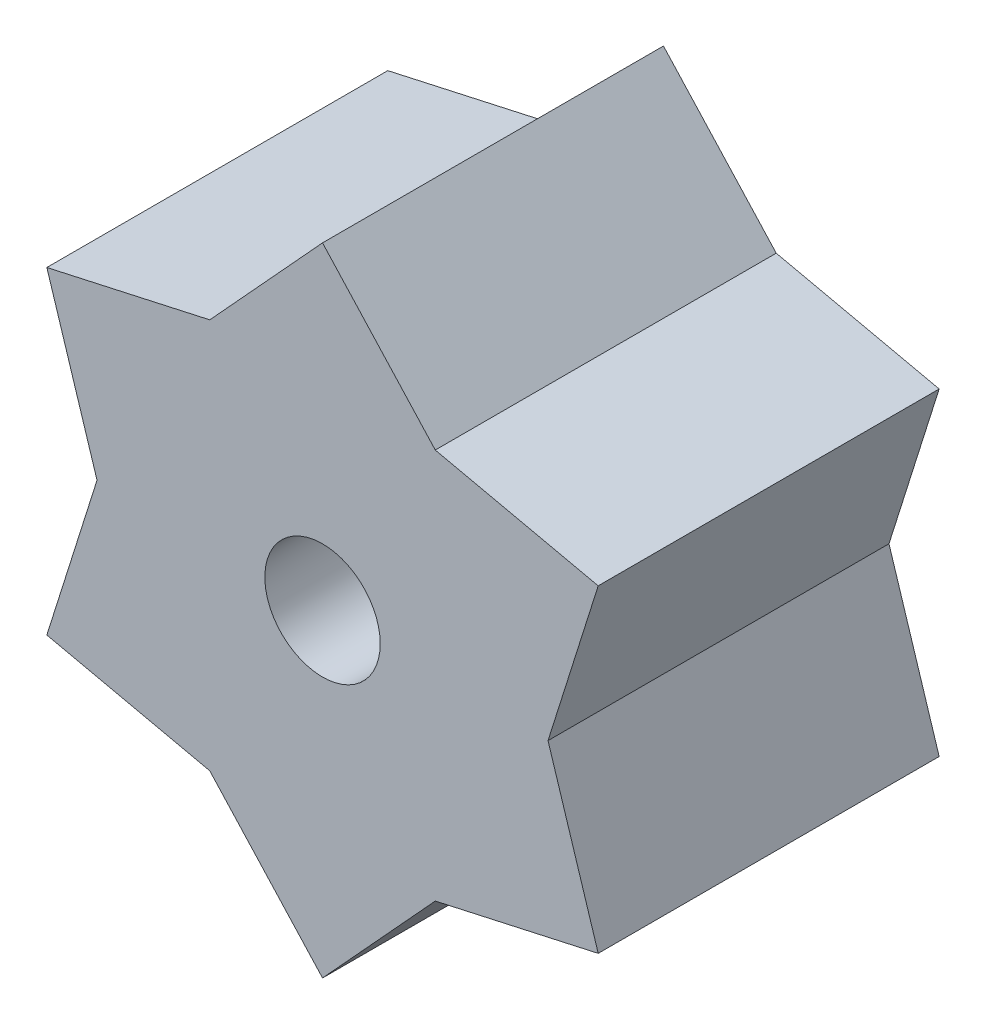
ISO-10303-21;
HEADER;
FILE_DESCRIPTION(('STEP AP214'),'2;1');
FILE_NAME('part.step','',(''),(''),'','','');
FILE_SCHEMA(('AUTOMOTIVE_DESIGN { 1 0 10303 214 1 1 1 1 }'));
ENDSEC;
DATA;
#1=APPLICATION_CONTEXT('core data for automotive mechanical design processes');
#2=APPLICATION_PROTOCOL_DEFINITION('international standard','automotive_design',2000,#1);
#3=PRODUCT_CONTEXT('',#1,'mechanical');
#4=PRODUCT('Part','Part','',(#3));
#5=PRODUCT_RELATED_PRODUCT_CATEGORY('part','',(#4));
#6=PRODUCT_DEFINITION_FORMATION('','',#4);
#7=PRODUCT_DEFINITION_CONTEXT('part definition',#1,'design');
#8=PRODUCT_DEFINITION('design','',#6,#7);
#9=PRODUCT_DEFINITION_SHAPE('','',#8);
#10=(LENGTH_UNIT() NAMED_UNIT(*) SI_UNIT(.MILLI.,.METRE.));
#11=(NAMED_UNIT(*) PLANE_ANGLE_UNIT() SI_UNIT($,.RADIAN.));
#12=(NAMED_UNIT(*) SI_UNIT($,.STERADIAN.) SOLID_ANGLE_UNIT());
#13=UNCERTAINTY_MEASURE_WITH_UNIT(LENGTH_MEASURE(1.E-05),#10,'distance_accuracy_value','');
#14=(GEOMETRIC_REPRESENTATION_CONTEXT(3) GLOBAL_UNCERTAINTY_ASSIGNED_CONTEXT((#13)) GLOBAL_UNIT_ASSIGNED_CONTEXT((#10,
#11,#12)) REPRESENTATION_CONTEXT('',''));
#15=CARTESIAN_POINT('',(0.,0.,0.));
#16=DIRECTION('',(0.,0.,1.));
#17=DIRECTION('',(1.,0.,0.));
#18=AXIS2_PLACEMENT_3D('',#15,#16,#17);
#19=CARTESIAN_POINT('',(3.91023949806773,1.23289377796754,-6.5));
#20=DIRECTION('',(-0.953716950748225,-0.300705799504278,0.));
#21=DIRECTION('',(0.300705799504278,-0.953716950748225,0.));
#22=AXIS2_PLACEMENT_3D('',#19,#20,#21);
#23=PLANE('',#22);
#24=DIRECTION('',(0.300705799504278,-0.953716950748225,0.));
#25=VECTOR('',#24,1.);
#26=CARTESIAN_POINT('',(3.91023949806773,1.23289377796754,0.));
#27=LINE('',#26,#25);
#28=CARTESIAN_POINT('',(4.29896941307734,0.,0.));
#29=VERTEX_POINT('',#28);
#30=CARTESIAN_POINT('',(5.25570695887913,-3.03438382749065,0.));
#31=VERTEX_POINT('',#30);
#32=EDGE_CURVE('E177',#29,#31,#27,.T.);
#33=ORIENTED_EDGE('',*,*,#32,.T.);
#34=DIRECTION('',(0.,0.,1.));
#35=VECTOR('',#34,1.);
#36=CARTESIAN_POINT('',(5.25570695887913,-3.03438382749065,-6.5));
#37=LINE('',#36,#35);
#38=CARTESIAN_POINT('',(5.25570695887913,-3.03438382749065,-6.5));
#39=VERTEX_POINT('',#38);
#40=EDGE_CURVE('E11',#39,#31,#37,.T.);
#41=ORIENTED_EDGE('',*,*,#40,.F.);
#42=DIRECTION('',(0.300705799504278,-0.953716950748225,0.));
#43=VECTOR('',#42,1.);
#44=CARTESIAN_POINT('',(3.91023949806773,1.23289377796754,-6.5));
#45=LINE('',#44,#43);
#46=CARTESIAN_POINT('',(4.29896941307734,0.,-6.5));
#47=VERTEX_POINT('',#46);
#48=EDGE_CURVE('E215',#47,#39,#45,.T.);
#49=ORIENTED_EDGE('',*,*,#48,.F.);
#50=DIRECTION('',(0.,0.,1.));
#51=VECTOR('',#50,1.);
#52=CARTESIAN_POINT('',(4.29896941307734,0.,-6.5));
#53=LINE('',#52,#51);
#54=EDGE_CURVE('E50',#47,#29,#53,.T.);
#55=ORIENTED_EDGE('',*,*,#54,.T.);
#56=EDGE_LOOP('',(#33,#41,#49,#55));
#57=FACE_BOUND('',#56,.T.);
#58=ADVANCED_FACE('F47',(#57),#23,.F.);
#59=CARTESIAN_POINT('',(0.887402417146234,-4.00281362919176,-6.5));
#60=DIRECTION('',(-0.216439613938104,0.976296007119933,0.));
#61=DIRECTION('',(-0.976296007119933,-0.216439613938104,0.));
#62=AXIS2_PLACEMENT_3D('',#59,#60,#61);
#63=PLANE('',#62);
#64=DIRECTION('',(-0.976296007119933,-0.216439613938104,0.));
#65=VECTOR('',#64,1.);
#66=CARTESIAN_POINT('',(0.887402417146234,-4.00281362919176,0.));
#67=LINE('',#66,#65);
#68=CARTESIAN_POINT('',(2.14948470653864,-3.72301672181728,0.));
#69=VERTEX_POINT('',#68);
#70=EDGE_CURVE('E103',#31,#69,#67,.T.);
#71=ORIENTED_EDGE('',*,*,#70,.T.);
#72=DIRECTION('',(0.,0.,1.));
#73=VECTOR('',#72,1.);
#74=CARTESIAN_POINT('',(2.14948470653864,-3.72301672181728,-6.5));
#75=LINE('',#74,#73);
#76=CARTESIAN_POINT('',(2.14948470653864,-3.72301672181728,-6.5));
#77=VERTEX_POINT('',#76);
#78=EDGE_CURVE('E57',#77,#69,#75,.T.);
#79=ORIENTED_EDGE('',*,*,#78,.F.);
#80=DIRECTION('',(-0.976296007119933,-0.216439613938104,0.));
#81=VECTOR('',#80,1.);
#82=CARTESIAN_POINT('',(0.887402417146234,-4.00281362919176,-6.5));
#83=LINE('',#82,#81);
#84=EDGE_CURVE('E65',#39,#77,#83,.T.);
#85=ORIENTED_EDGE('',*,*,#84,.F.);
#86=ORIENTED_EDGE('',*,*,#40,.T.);
#87=EDGE_LOOP('',(#71,#79,#85,#86));
#88=FACE_BOUND('',#87,.T.);
#89=ADVANCED_FACE('F273',(#88),#63,.F.);
#90=CARTESIAN_POINT('',(3.02283708092152,-2.76991985122419,-6.5));
#91=DIRECTION('',(-0.737277336810128,0.675590207615656,0.));
#92=DIRECTION('',(-0.675590207615656,-0.737277336810128,0.));
#93=AXIS2_PLACEMENT_3D('',#90,#91,#92);
#94=PLANE('',#93);
#95=DIRECTION('',(-0.675590207615656,-0.737277336810128,0.));
#96=VECTOR('',#95,1.);
#97=CARTESIAN_POINT('',(3.02283708092152,-2.76991985122419,0.));
#98=LINE('',#97,#96);
#99=CARTESIAN_POINT('',(0.,-6.06876765498131,0.));
#100=VERTEX_POINT('',#99);
#101=EDGE_CURVE('E154',#69,#100,#98,.T.);
#102=ORIENTED_EDGE('',*,*,#101,.T.);
#103=DIRECTION('',(0.,0.,1.));
#104=VECTOR('',#103,1.);
#105=CARTESIAN_POINT('',(0.,-6.06876765498131,-6.5));
#106=LINE('',#105,#104);
#107=CARTESIAN_POINT('',(0.,-6.06876765498131,-6.5));
#108=VERTEX_POINT('',#107);
#109=EDGE_CURVE('E152',#108,#100,#106,.T.);
#110=ORIENTED_EDGE('',*,*,#109,.F.);
#111=DIRECTION('',(-0.675590207615656,-0.737277336810128,0.));
#112=VECTOR('',#111,1.);
#113=CARTESIAN_POINT('',(3.02283708092152,-2.76991985122419,-6.5));
#114=LINE('',#113,#112);
#115=EDGE_CURVE('E141',#77,#108,#114,.T.);
#116=ORIENTED_EDGE('',*,*,#115,.F.);
#117=ORIENTED_EDGE('',*,*,#78,.T.);
#118=EDGE_LOOP('',(#102,#110,#116,#117));
#119=FACE_BOUND('',#118,.T.);
#120=ADVANCED_FACE('F153',(#119),#94,.F.);
#121=CARTESIAN_POINT('',(-3.02283708092153,-2.76991985122423,-6.5));
#122=DIRECTION('',(0.737277336810123,0.675590207615661,0.));
#123=DIRECTION('',(-0.675590207615661,0.737277336810123,0.));
#124=AXIS2_PLACEMENT_3D('',#121,#122,#123);
#125=PLANE('',#124);
#126=DIRECTION('',(-0.675590207615661,0.737277336810123,0.));
#127=VECTOR('',#126,1.);
#128=CARTESIAN_POINT('',(-3.02283708092153,-2.76991985122423,0.));
#129=LINE('',#128,#127);
#130=CARTESIAN_POINT('',(-2.1494847065387,-3.72301672181724,0.));
#131=VERTEX_POINT('',#130);
#132=EDGE_CURVE('E205',#100,#131,#129,.T.);
#133=ORIENTED_EDGE('',*,*,#132,.T.);
#134=DIRECTION('',(0.,0.,1.));
#135=VECTOR('',#134,1.);
#136=CARTESIAN_POINT('',(-2.1494847065387,-3.72301672181724,-6.5));
#137=LINE('',#136,#135);
#138=CARTESIAN_POINT('',(-2.1494847065387,-3.72301672181724,-6.5));
#139=VERTEX_POINT('',#138);
#140=EDGE_CURVE('E158',#139,#131,#137,.T.);
#141=ORIENTED_EDGE('',*,*,#140,.F.);
#142=DIRECTION('',(-0.675590207615661,0.737277336810123,0.));
#143=VECTOR('',#142,1.);
#144=CARTESIAN_POINT('',(-3.02283708092153,-2.76991985122423,-6.5));
#145=LINE('',#144,#143);
#146=EDGE_CURVE('E146',#108,#139,#145,.T.);
#147=ORIENTED_EDGE('',*,*,#146,.F.);
#148=ORIENTED_EDGE('',*,*,#109,.T.);
#149=EDGE_LOOP('',(#133,#141,#147,#148));
#150=FACE_BOUND('',#149,.T.);
#151=ADVANCED_FACE('F160',(#150),#125,.F.);
#152=CARTESIAN_POINT('',(-0.8874024171462,-4.00281362919173,-6.5));
#153=DIRECTION('',(0.216439613938097,0.976296007119934,0.));
#154=DIRECTION('',(-0.976296007119935,0.216439613938097,0.));
#155=AXIS2_PLACEMENT_3D('',#152,#153,#154);
#156=PLANE('',#155);
#157=DIRECTION('',(-0.976296007119935,0.216439613938097,0.));
#158=VECTOR('',#157,1.);
#159=CARTESIAN_POINT('',(-0.8874024171462,-4.00281362919173,0.));
#160=LINE('',#159,#158);
#161=CARTESIAN_POINT('',(-5.25570695887913,-3.03438382749066,0.));
#162=VERTEX_POINT('',#161);
#163=EDGE_CURVE('E202',#131,#162,#160,.T.);
#164=ORIENTED_EDGE('',*,*,#163,.T.);
#165=DIRECTION('',(0.,0.,1.));
#166=VECTOR('',#165,1.);
#167=CARTESIAN_POINT('',(-5.25570695887913,-3.03438382749066,-6.5));
#168=LINE('',#167,#166);
#169=CARTESIAN_POINT('',(-5.25570695887913,-3.03438382749066,-6.5));
#170=VERTEX_POINT('',#169);
#171=EDGE_CURVE('E221',#170,#162,#168,.T.);
#172=ORIENTED_EDGE('',*,*,#171,.F.);
#173=DIRECTION('',(-0.976296007119935,0.216439613938097,0.));
#174=VECTOR('',#173,1.);
#175=CARTESIAN_POINT('',(-0.8874024171462,-4.00281362919173,-6.5));
#176=LINE('',#175,#174);
#177=EDGE_CURVE('E164',#139,#170,#176,.T.);
#178=ORIENTED_EDGE('',*,*,#177,.F.);
#179=ORIENTED_EDGE('',*,*,#140,.T.);
#180=EDGE_LOOP('',(#164,#172,#178,#179));
#181=FACE_BOUND('',#180,.T.);
#182=ADVANCED_FACE('F286',(#181),#156,.F.);
#183=CARTESIAN_POINT('',(-3.91023949806776,1.23289377796752,-6.5));
#184=DIRECTION('',(0.953716950748227,-0.300705799504272,0.));
#185=DIRECTION('',(0.300705799504272,0.953716950748227,0.));
#186=AXIS2_PLACEMENT_3D('',#183,#184,#185);
#187=PLANE('',#186);
#188=DIRECTION('',(0.300705799504272,0.953716950748227,0.));
#189=VECTOR('',#188,1.);
#190=CARTESIAN_POINT('',(-3.91023949806776,1.23289377796752,0.));
#191=LINE('',#190,#189);
#192=CARTESIAN_POINT('',(-4.29896941307734,0.,0.));
#193=VERTEX_POINT('',#192);
#194=EDGE_CURVE('E199',#162,#193,#191,.T.);
#195=ORIENTED_EDGE('',*,*,#194,.T.);
#196=DIRECTION('',(0.,0.,1.));
#197=VECTOR('',#196,1.);
#198=CARTESIAN_POINT('',(-4.29896941307734,0.,-6.5));
#199=LINE('',#198,#197);
#200=CARTESIAN_POINT('',(-4.29896941307734,0.,-6.5));
#201=VERTEX_POINT('',#200);
#202=EDGE_CURVE('E225',#201,#193,#199,.T.);
#203=ORIENTED_EDGE('',*,*,#202,.F.);
#204=DIRECTION('',(0.300705799504272,0.953716950748227,0.));
#205=VECTOR('',#204,1.);
#206=CARTESIAN_POINT('',(-3.91023949806776,1.23289377796752,-6.5));
#207=LINE('',#206,#205);
#208=EDGE_CURVE('E167',#170,#201,#207,.T.);
#209=ORIENTED_EDGE('',*,*,#208,.F.);
#210=ORIENTED_EDGE('',*,*,#171,.T.);
#211=EDGE_LOOP('',(#195,#203,#209,#210));
#212=FACE_BOUND('',#211,.T.);
#213=ADVANCED_FACE('F289',(#212),#187,.F.);
#214=CARTESIAN_POINT('',(-3.91023949806773,-1.23289377796754,-6.5));
#215=DIRECTION('',(0.953716950748225,0.300705799504278,0.));
#216=DIRECTION('',(-0.300705799504278,0.953716950748225,0.));
#217=AXIS2_PLACEMENT_3D('',#214,#215,#216);
#218=PLANE('',#217);
#219=DIRECTION('',(-0.300705799504278,0.953716950748225,0.));
#220=VECTOR('',#219,1.);
#221=CARTESIAN_POINT('',(-3.91023949806773,-1.23289377796754,0.));
#222=LINE('',#221,#220);
#223=CARTESIAN_POINT('',(-5.25570695887913,3.03438382749065,0.));
#224=VERTEX_POINT('',#223);
#225=EDGE_CURVE('E196',#193,#224,#222,.T.);
#226=ORIENTED_EDGE('',*,*,#225,.T.);
#227=DIRECTION('',(0.,0.,1.));
#228=VECTOR('',#227,1.);
#229=CARTESIAN_POINT('',(-5.25570695887913,3.03438382749065,-6.5));
#230=LINE('',#229,#228);
#231=CARTESIAN_POINT('',(-5.25570695887913,3.03438382749065,-6.5));
#232=VERTEX_POINT('',#231);
#233=EDGE_CURVE('E229',#232,#224,#230,.T.);
#234=ORIENTED_EDGE('',*,*,#233,.F.);
#235=DIRECTION('',(-0.300705799504278,0.953716950748225,0.));
#236=VECTOR('',#235,1.);
#237=CARTESIAN_POINT('',(-3.91023949806773,-1.23289377796754,-6.5));
#238=LINE('',#237,#236);
#239=EDGE_CURVE('E331',#201,#232,#238,.T.);
#240=ORIENTED_EDGE('',*,*,#239,.F.);
#241=ORIENTED_EDGE('',*,*,#202,.T.);
#242=EDGE_LOOP('',(#226,#234,#240,#241));
#243=FACE_BOUND('',#242,.T.);
#244=ADVANCED_FACE('F293',(#243),#218,.F.);
#245=CARTESIAN_POINT('',(-0.887402417146237,4.00281362919176,-6.5));
#246=DIRECTION('',(0.216439613938105,-0.976296007119933,0.));
#247=DIRECTION('',(0.976296007119933,0.216439613938105,0.));
#248=AXIS2_PLACEMENT_3D('',#245,#246,#247);
#249=PLANE('',#248);
#250=DIRECTION('',(0.976296007119933,0.216439613938105,0.));
#251=VECTOR('',#250,1.);
#252=CARTESIAN_POINT('',(-0.887402417146237,4.00281362919176,0.));
#253=LINE('',#252,#251);
#254=CARTESIAN_POINT('',(-2.14948470653864,3.72301672181727,0.));
#255=VERTEX_POINT('',#254);
#256=EDGE_CURVE('E193',#224,#255,#253,.T.);
#257=ORIENTED_EDGE('',*,*,#256,.T.);
#258=DIRECTION('',(0.,0.,1.));
#259=VECTOR('',#258,1.);
#260=CARTESIAN_POINT('',(-2.14948470653864,3.72301672181727,-6.5));
#261=LINE('',#260,#259);
#262=CARTESIAN_POINT('',(-2.14948470653864,3.72301672181727,-6.5));
#263=VERTEX_POINT('',#262);
#264=EDGE_CURVE('E233',#263,#255,#261,.T.);
#265=ORIENTED_EDGE('',*,*,#264,.F.);
#266=DIRECTION('',(0.976296007119933,0.216439613938105,0.));
#267=VECTOR('',#266,1.);
#268=CARTESIAN_POINT('',(-0.887402417146237,4.00281362919176,-6.5));
#269=LINE('',#268,#267);
#270=EDGE_CURVE('E328',#232,#263,#269,.T.);
#271=ORIENTED_EDGE('',*,*,#270,.F.);
#272=ORIENTED_EDGE('',*,*,#233,.T.);
#273=EDGE_LOOP('',(#257,#265,#271,#272));
#274=FACE_BOUND('',#273,.T.);
#275=ADVANCED_FACE('F297',(#274),#249,.F.);
#276=CARTESIAN_POINT('',(-3.02283708092152,2.76991985122419,-6.5));
#277=DIRECTION('',(0.737277336810127,-0.675590207615657,0.));
#278=DIRECTION('',(0.675590207615657,0.737277336810127,0.));
#279=AXIS2_PLACEMENT_3D('',#276,#277,#278);
#280=PLANE('',#279);
#281=DIRECTION('',(0.675590207615657,0.737277336810128,0.));
#282=VECTOR('',#281,1.);
#283=CARTESIAN_POINT('',(-3.02283708092152,2.76991985122419,0.));
#284=LINE('',#283,#282);
#285=CARTESIAN_POINT('',(0.,6.06876765498131,0.));
#286=VERTEX_POINT('',#285);
#287=EDGE_CURVE('E190',#255,#286,#284,.T.);
#288=ORIENTED_EDGE('',*,*,#287,.T.);
#289=DIRECTION('',(0.,0.,1.));
#290=VECTOR('',#289,1.);
#291=CARTESIAN_POINT('',(0.,6.06876765498131,-6.5));
#292=LINE('',#291,#290);
#293=CARTESIAN_POINT('',(0.,6.06876765498131,-6.5));
#294=VERTEX_POINT('',#293);
#295=EDGE_CURVE('E237',#294,#286,#292,.T.);
#296=ORIENTED_EDGE('',*,*,#295,.F.);
#297=DIRECTION('',(0.675590207615657,0.737277336810128,0.));
#298=VECTOR('',#297,1.);
#299=CARTESIAN_POINT('',(-3.02283708092152,2.76991985122419,-6.5));
#300=LINE('',#299,#298);
#301=EDGE_CURVE('E321',#263,#294,#300,.T.);
#302=ORIENTED_EDGE('',*,*,#301,.F.);
#303=ORIENTED_EDGE('',*,*,#264,.T.);
#304=EDGE_LOOP('',(#288,#296,#302,#303));
#305=FACE_BOUND('',#304,.T.);
#306=ADVANCED_FACE('F301',(#305),#280,.F.);
#307=CARTESIAN_POINT('',(3.02283708092153,2.76991985122423,-6.5));
#308=DIRECTION('',(-0.737277336810123,-0.675590207615661,0.));
#309=DIRECTION('',(0.675590207615661,-0.737277336810123,0.));
#310=AXIS2_PLACEMENT_3D('',#307,#308,#309);
#311=PLANE('',#310);
#312=DIRECTION('',(0.675590207615661,-0.737277336810123,0.));
#313=VECTOR('',#312,1.);
#314=CARTESIAN_POINT('',(3.02283708092153,2.76991985122423,0.));
#315=LINE('',#314,#313);
#316=CARTESIAN_POINT('',(2.1494847065387,3.72301672181724,0.));
#317=VERTEX_POINT('',#316);
#318=EDGE_CURVE('E187',#286,#317,#315,.T.);
#319=ORIENTED_EDGE('',*,*,#318,.T.);
#320=DIRECTION('',(0.,0.,1.));
#321=VECTOR('',#320,1.);
#322=CARTESIAN_POINT('',(2.1494847065387,3.72301672181724,-6.5));
#323=LINE('',#322,#321);
#324=CARTESIAN_POINT('',(2.1494847065387,3.72301672181724,-6.5));
#325=VERTEX_POINT('',#324);
#326=EDGE_CURVE('E241',#325,#317,#323,.T.);
#327=ORIENTED_EDGE('',*,*,#326,.F.);
#328=DIRECTION('',(0.675590207615661,-0.737277336810123,0.));
#329=VECTOR('',#328,1.);
#330=CARTESIAN_POINT('',(3.02283708092153,2.76991985122423,-6.5));
#331=LINE('',#330,#329);
#332=EDGE_CURVE('E317',#294,#325,#331,.T.);
#333=ORIENTED_EDGE('',*,*,#332,.F.);
#334=ORIENTED_EDGE('',*,*,#295,.T.);
#335=EDGE_LOOP('',(#319,#327,#333,#334));
#336=FACE_BOUND('',#335,.T.);
#337=ADVANCED_FACE('F269',(#336),#311,.F.);
#338=CARTESIAN_POINT('',(0.887402417146201,4.00281362919173,-6.5));
#339=DIRECTION('',(-0.216439613938098,-0.976296007119935,0.));
#340=DIRECTION('',(0.976296007119935,-0.216439613938098,0.));
#341=AXIS2_PLACEMENT_3D('',#338,#339,#340);
#342=PLANE('',#341);
#343=DIRECTION('',(0.976296007119935,-0.216439613938098,0.));
#344=VECTOR('',#343,1.);
#345=CARTESIAN_POINT('',(0.887402417146201,4.00281362919173,0.));
#346=LINE('',#345,#344);
#347=CARTESIAN_POINT('',(5.25570695887913,3.03438382749065,0.));
#348=VERTEX_POINT('',#347);
#349=EDGE_CURVE('E184',#317,#348,#346,.T.);
#350=ORIENTED_EDGE('',*,*,#349,.T.);
#351=DIRECTION('',(0.,0.,1.));
#352=VECTOR('',#351,1.);
#353=CARTESIAN_POINT('',(5.25570695887913,3.03438382749065,-6.5));
#354=LINE('',#353,#352);
#355=CARTESIAN_POINT('',(5.25570695887913,3.03438382749065,-6.5));
#356=VERTEX_POINT('',#355);
#357=EDGE_CURVE('E244',#356,#348,#354,.T.);
#358=ORIENTED_EDGE('',*,*,#357,.F.);
#359=DIRECTION('',(0.976296007119935,-0.216439613938098,0.));
#360=VECTOR('',#359,1.);
#361=CARTESIAN_POINT('',(0.887402417146201,4.00281362919173,-6.5));
#362=LINE('',#361,#360);
#363=EDGE_CURVE('E315',#325,#356,#362,.T.);
#364=ORIENTED_EDGE('',*,*,#363,.F.);
#365=ORIENTED_EDGE('',*,*,#326,.T.);
#366=EDGE_LOOP('',(#350,#358,#364,#365));
#367=FACE_BOUND('',#366,.T.);
#368=ADVANCED_FACE('F262',(#367),#342,.F.);
#369=CARTESIAN_POINT('',(3.91023949806776,-1.23289377796752,-6.5));
#370=DIRECTION('',(-0.953716950748227,0.300705799504272,0.));
#371=DIRECTION('',(-0.300705799504272,-0.953716950748227,0.));
#372=AXIS2_PLACEMENT_3D('',#369,#370,#371);
#373=PLANE('',#372);
#374=DIRECTION('',(-0.300705799504272,-0.953716950748227,0.));
#375=VECTOR('',#374,1.);
#376=CARTESIAN_POINT('',(3.91023949806776,-1.23289377796752,0.));
#377=LINE('',#376,#375);
#378=EDGE_CURVE('E181',#348,#29,#377,.T.);
#379=ORIENTED_EDGE('',*,*,#378,.T.);
#380=ORIENTED_EDGE('',*,*,#54,.F.);
#381=DIRECTION('',(-0.300705799504272,-0.953716950748227,0.));
#382=VECTOR('',#381,1.);
#383=CARTESIAN_POINT('',(3.91023949806776,-1.23289377796752,-6.5));
#384=LINE('',#383,#382);
#385=EDGE_CURVE('E115',#356,#47,#384,.T.);
#386=ORIENTED_EDGE('',*,*,#385,.F.);
#387=ORIENTED_EDGE('',*,*,#357,.T.);
#388=EDGE_LOOP('',(#379,#380,#386,#387));
#389=FACE_BOUND('',#388,.T.);
#390=ADVANCED_FACE('F259',(#389),#373,.F.);
#391=CARTESIAN_POINT('',(0.,0.,-6.5));
#392=DIRECTION('',(0.,0.,1.));
#393=DIRECTION('',(1.,0.,0.));
#394=AXIS2_PLACEMENT_3D('',#391,#392,#393);
#395=CYLINDRICAL_SURFACE('',#394,1.1);
#396=CARTESIAN_POINT('',(0.,0.,-6.5));
#397=DIRECTION('',(0.,0.,1.));
#398=DIRECTION('',(1.,0.,0.));
#399=AXIS2_PLACEMENT_3D('',#396,#397,#398);
#400=CIRCLE('',#399,1.1);
#401=CARTESIAN_POINT('',(1.1,0.,-6.5));
#402=VERTEX_POINT('',#401);
#403=EDGE_CURVE('E173',#402,#402,#400,.T.);
#404=CARTESIAN_POINT('',(0.,0.,0.));
#405=DIRECTION('',(0.,0.,1.));
#406=DIRECTION('',(1.,0.,0.));
#407=AXIS2_PLACEMENT_3D('',#404,#405,#406);
#408=CIRCLE('',#407,1.1);
#409=CARTESIAN_POINT('',(1.1,0.,0.));
#410=VERTEX_POINT('',#409);
#411=EDGE_CURVE('E212',#410,#410,#408,.T.);
#412=CARTESIAN_POINT('',(1.1,0.,-6.5));
#413=CARTESIAN_POINT('',(1.1,0.,-6.43229166666667));
#414=CARTESIAN_POINT('',(1.1,0.,-6.36458333333333));
#415=CARTESIAN_POINT('',(1.1,0.,-6.22916666666667));
#416=CARTESIAN_POINT('',(1.1,0.,-6.16145833333333));
#417=CARTESIAN_POINT('',(1.1,0.,-6.02604166666667));
#418=CARTESIAN_POINT('',(1.1,0.,-5.95833333333333));
#419=CARTESIAN_POINT('',(1.1,0.,-5.82291666666667));
#420=CARTESIAN_POINT('',(1.1,0.,-5.75520833333333));
#421=CARTESIAN_POINT('',(1.1,0.,-5.61979166666667));
#422=CARTESIAN_POINT('',(1.1,0.,-5.55208333333333));
#423=CARTESIAN_POINT('',(1.1,0.,-5.41666666666667));
#424=CARTESIAN_POINT('',(1.1,0.,-5.34895833333333));
#425=CARTESIAN_POINT('',(1.1,0.,-5.21354166666667));
#426=CARTESIAN_POINT('',(1.1,0.,-5.14583333333333));
#427=CARTESIAN_POINT('',(1.1,0.,-5.01041666666667));
#428=CARTESIAN_POINT('',(1.1,0.,-4.94270833333333));
#429=CARTESIAN_POINT('',(1.1,0.,-4.80729166666667));
#430=CARTESIAN_POINT('',(1.1,0.,-4.73958333333333));
#431=CARTESIAN_POINT('',(1.1,0.,-4.60416666666667));
#432=CARTESIAN_POINT('',(1.1,0.,-4.53645833333333));
#433=CARTESIAN_POINT('',(1.1,0.,-4.40104166666667));
#434=CARTESIAN_POINT('',(1.1,0.,-4.33333333333333));
#435=CARTESIAN_POINT('',(1.1,0.,-4.19791666666667));
#436=CARTESIAN_POINT('',(1.1,0.,-4.13020833333333));
#437=CARTESIAN_POINT('',(1.1,0.,-3.99479166666667));
#438=CARTESIAN_POINT('',(1.1,0.,-3.92708333333333));
#439=CARTESIAN_POINT('',(1.1,0.,-3.79166666666667));
#440=CARTESIAN_POINT('',(1.1,0.,-3.72395833333333));
#441=CARTESIAN_POINT('',(1.1,0.,-3.58854166666667));
#442=CARTESIAN_POINT('',(1.1,0.,-3.52083333333333));
#443=CARTESIAN_POINT('',(1.1,0.,-3.38541666666667));
#444=CARTESIAN_POINT('',(1.1,0.,-3.31770833333333));
#445=CARTESIAN_POINT('',(1.1,0.,-3.18229166666667));
#446=CARTESIAN_POINT('',(1.1,0.,-3.11458333333333));
#447=CARTESIAN_POINT('',(1.1,0.,-2.97916666666667));
#448=CARTESIAN_POINT('',(1.1,0.,-2.91145833333333));
#449=CARTESIAN_POINT('',(1.1,0.,-2.77604166666667));
#450=CARTESIAN_POINT('',(1.1,0.,-2.70833333333333));
#451=CARTESIAN_POINT('',(1.1,0.,-2.57291666666667));
#452=CARTESIAN_POINT('',(1.1,0.,-2.50520833333333));
#453=CARTESIAN_POINT('',(1.1,0.,-2.36979166666667));
#454=CARTESIAN_POINT('',(1.1,0.,-2.30208333333333));
#455=CARTESIAN_POINT('',(1.1,0.,-2.16666666666667));
#456=CARTESIAN_POINT('',(1.1,0.,-2.09895833333333));
#457=CARTESIAN_POINT('',(1.1,0.,-1.96354166666667));
#458=CARTESIAN_POINT('',(1.1,0.,-1.89583333333333));
#459=CARTESIAN_POINT('',(1.1,0.,-1.76041666666667));
#460=CARTESIAN_POINT('',(1.1,0.,-1.69270833333333));
#461=CARTESIAN_POINT('',(1.1,0.,-1.55729166666667));
#462=CARTESIAN_POINT('',(1.1,0.,-1.48958333333333));
#463=CARTESIAN_POINT('',(1.1,0.,-1.35416666666667));
#464=CARTESIAN_POINT('',(1.1,0.,-1.28645833333333));
#465=CARTESIAN_POINT('',(1.1,0.,-1.15104166666667));
#466=CARTESIAN_POINT('',(1.1,0.,-1.08333333333333));
#467=CARTESIAN_POINT('',(1.1,0.,-0.947916666666667));
#468=CARTESIAN_POINT('',(1.1,0.,-0.880208333333333));
#469=CARTESIAN_POINT('',(1.1,0.,-0.744791666666667));
#470=CARTESIAN_POINT('',(1.1,0.,-0.677083333333333));
#471=CARTESIAN_POINT('',(1.1,0.,-0.541666666666667));
#472=CARTESIAN_POINT('',(1.1,0.,-0.473958333333333));
#473=CARTESIAN_POINT('',(1.1,0.,-0.338541666666667));
#474=CARTESIAN_POINT('',(1.1,0.,-0.270833333333334));
#475=CARTESIAN_POINT('',(1.1,0.,-0.135416666666667));
#476=CARTESIAN_POINT('',(1.1,0.,-0.0677083333333334));
#477=CARTESIAN_POINT('',(1.1,0.,0.));
#478=B_SPLINE_CURVE_WITH_KNOTS('',3,(#412,#413,#414,#415,#416,#417,#418,#419,#420,#421,#422,
#423,#424,#425,#426,#427,#428,#429,#430,#431,#432,#433,#434,#435,#436,#437,#438,#439,#440,#441,
#442,#443,#444,#445,#446,#447,#448,#449,#450,#451,#452,#453,#454,#455,#456,#457,#458,#459,#460,
#461,#462,#463,#464,#465,#466,#467,#468,#469,#470,#471,#472,#473,#474,#475,#476,#477),
.UNSPECIFIED.,.F.,.F.,(4,2,2,2,2,2,2,2,2,2,2,2,2,2,2,2,2,2,2,2,2,2,2,2,2,2,2,2,2,2,2,2,4),(0.,
0.203124999999999,0.40625,0.609375,0.8125,1.015625,1.21875,1.421875,1.625,1.828125,2.03125,
2.234375,2.4375,2.640625,2.84375,3.046875,3.25,3.453125,3.65625,3.859375,4.0625,4.265625,
4.46875,4.671875,4.875,5.078125,5.28125,5.484375,5.6875,5.890625,6.09375,6.296875,6.5),.UNSPECIFIED.);
#479=EDGE_CURVE('BSEAM261',#402,#410,#478,.T.);
#480=ORIENTED_EDGE('',*,*,#403,.F.);
#481=ORIENTED_EDGE('',*,*,#411,.T.);
#482=ORIENTED_EDGE('',*,*,#479,.T.);
#483=ORIENTED_EDGE('',*,*,#479,.F.);
#484=EDGE_LOOP('',(#480,#482,#481,#483));
#485=FACE_BOUND('',#484,.T.);
#486=ADVANCED_FACE('F261',(#485),#395,.F.);
#487=CARTESIAN_POINT('',(0.,0.,-6.5));
#488=DIRECTION('',(0.,0.,1.));
#489=DIRECTION('',(1.,0.,0.));
#490=AXIS2_PLACEMENT_3D('',#487,#488,#489);
#491=PLANE('',#490);
#492=ORIENTED_EDGE('',*,*,#48,.T.);
#493=ORIENTED_EDGE('',*,*,#84,.T.);
#494=ORIENTED_EDGE('',*,*,#115,.T.);
#495=ORIENTED_EDGE('',*,*,#146,.T.);
#496=ORIENTED_EDGE('',*,*,#177,.T.);
#497=ORIENTED_EDGE('',*,*,#208,.T.);
#498=ORIENTED_EDGE('',*,*,#239,.T.);
#499=ORIENTED_EDGE('',*,*,#270,.T.);
#500=ORIENTED_EDGE('',*,*,#301,.T.);
#501=ORIENTED_EDGE('',*,*,#332,.T.);
#502=ORIENTED_EDGE('',*,*,#363,.T.);
#503=ORIENTED_EDGE('',*,*,#385,.T.);
#504=EDGE_LOOP('',(#492,#493,#494,#495,#496,#497,#498,#499,#500,#501,#502,#503));
#505=FACE_BOUND('',#504,.T.);
#506=ORIENTED_EDGE('',*,*,#403,.T.);
#507=EDGE_LOOP('',(#506));
#508=FACE_BOUND('',#507,.T.);
#509=ADVANCED_FACE('F143',(#505,#508),#491,.F.);
#510=CARTESIAN_POINT('',(0.,0.,0.));
#511=DIRECTION('',(0.,0.,1.));
#512=DIRECTION('',(1.,0.,0.));
#513=AXIS2_PLACEMENT_3D('',#510,#511,#512);
#514=PLANE('',#513);
#515=ORIENTED_EDGE('',*,*,#32,.F.);
#516=ORIENTED_EDGE('',*,*,#378,.F.);
#517=ORIENTED_EDGE('',*,*,#349,.F.);
#518=ORIENTED_EDGE('',*,*,#318,.F.);
#519=ORIENTED_EDGE('',*,*,#287,.F.);
#520=ORIENTED_EDGE('',*,*,#256,.F.);
#521=ORIENTED_EDGE('',*,*,#225,.F.);
#522=ORIENTED_EDGE('',*,*,#194,.F.);
#523=ORIENTED_EDGE('',*,*,#163,.F.);
#524=ORIENTED_EDGE('',*,*,#132,.F.);
#525=ORIENTED_EDGE('',*,*,#101,.F.);
#526=ORIENTED_EDGE('',*,*,#70,.F.);
#527=EDGE_LOOP('',(#515,#516,#517,#518,#519,#520,#521,#522,#523,#524,#525,#526));
#528=FACE_BOUND('',#527,.T.);
#529=ORIENTED_EDGE('',*,*,#411,.F.);
#530=EDGE_LOOP('',(#529));
#531=FACE_BOUND('',#530,.T.);
#532=ADVANCED_FACE('F255',(#528,#531),#514,.T.);
#533=CLOSED_SHELL('',(#58,#89,#120,#151,#182,#213,#244,#275,#306,#337,#368,#390,#486,#509,#532));
#534=MANIFOLD_SOLID_BREP('B2',#533);
#535=ADVANCED_BREP_SHAPE_REPRESENTATION('',(#18,#534),#14);
#536=SHAPE_DEFINITION_REPRESENTATION(#9,#535);
ENDSEC;
END-ISO-10303-21;
